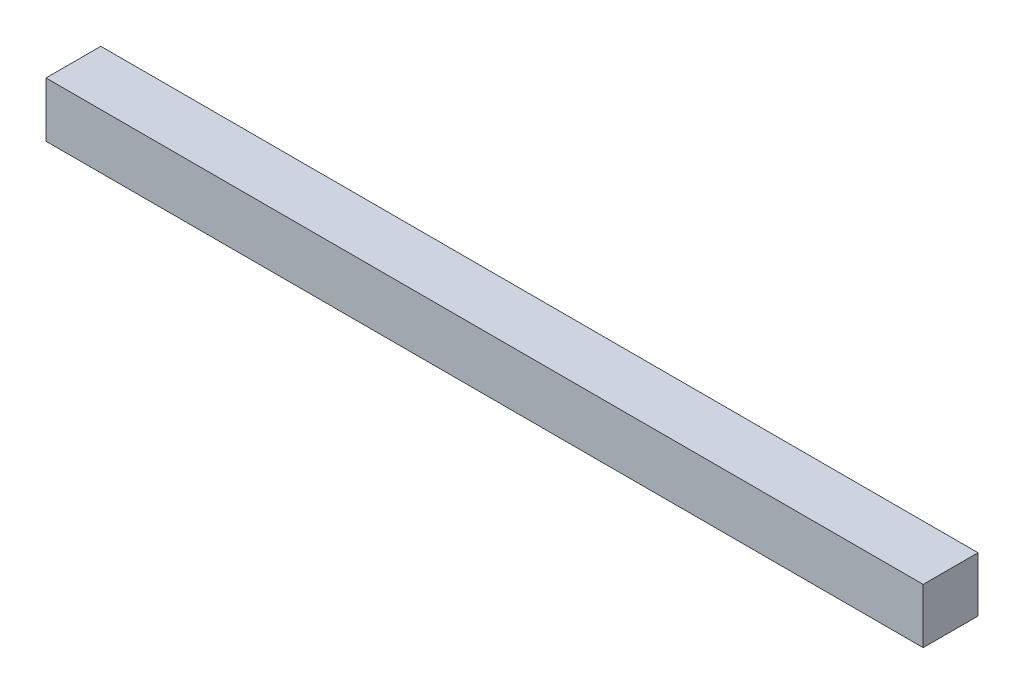
ISO-10303-21;
HEADER;
FILE_DESCRIPTION(('STEP AP214'),'2;1');
FILE_NAME('part.step','',(''),(''),'','','');
FILE_SCHEMA(('AUTOMOTIVE_DESIGN { 1 0 10303 214 1 1 1 1 }'));
ENDSEC;
DATA;
#1=APPLICATION_CONTEXT('core data for automotive mechanical design processes');
#2=APPLICATION_PROTOCOL_DEFINITION('international standard','automotive_design',2000,#1);
#3=PRODUCT_CONTEXT('',#1,'mechanical');
#4=PRODUCT('Part','Part','',(#3));
#5=PRODUCT_RELATED_PRODUCT_CATEGORY('part','',(#4));
#6=PRODUCT_DEFINITION_FORMATION('','',#4);
#7=PRODUCT_DEFINITION_CONTEXT('part definition',#1,'design');
#8=PRODUCT_DEFINITION('design','',#6,#7);
#9=PRODUCT_DEFINITION_SHAPE('','',#8);
#10=(LENGTH_UNIT() NAMED_UNIT(*) SI_UNIT(.MILLI.,.METRE.));
#11=(NAMED_UNIT(*) PLANE_ANGLE_UNIT() SI_UNIT($,.RADIAN.));
#12=(NAMED_UNIT(*) SI_UNIT($,.STERADIAN.) SOLID_ANGLE_UNIT());
#13=UNCERTAINTY_MEASURE_WITH_UNIT(LENGTH_MEASURE(1.E-05),#10,'distance_accuracy_value','');
#14=(GEOMETRIC_REPRESENTATION_CONTEXT(3) GLOBAL_UNCERTAINTY_ASSIGNED_CONTEXT((#13)) GLOBAL_UNIT_ASSIGNED_CONTEXT((#10,
#11,#12)) REPRESENTATION_CONTEXT('',''));
#15=CARTESIAN_POINT('',(0.,0.,0.));
#16=DIRECTION('',(0.,0.,1.));
#17=DIRECTION('',(1.,0.,0.));
#18=AXIS2_PLACEMENT_3D('',#15,#16,#17);
#19=CARTESIAN_POINT('',(50.8,-3.175,3.175));
#20=DIRECTION('',(0.,0.,-1.));
#21=DIRECTION('',(-1.,0.,0.));
#22=AXIS2_PLACEMENT_3D('',#19,#20,#21);
#23=PLANE('',#22);
#24=DIRECTION('',(0.,-1.,0.));
#25=VECTOR('',#24,1.);
#26=CARTESIAN_POINT('',(-50.8,-3.175,3.175));
#27=LINE('',#26,#25);
#28=CARTESIAN_POINT('',(-50.8,3.175,3.175));
#29=VERTEX_POINT('',#28);
#30=CARTESIAN_POINT('',(-50.8,-3.175,3.175));
#31=VERTEX_POINT('',#30);
#32=EDGE_CURVE('E96',#29,#31,#27,.T.);
#33=ORIENTED_EDGE('',*,*,#32,.T.);
#34=DIRECTION('',(-1.,0.,0.));
#35=VECTOR('',#34,1.);
#36=CARTESIAN_POINT('',(50.8,-3.175,3.175));
#37=LINE('',#36,#35);
#38=CARTESIAN_POINT('',(50.8,-3.175,3.175));
#39=VERTEX_POINT('',#38);
#40=EDGE_CURVE('E11',#39,#31,#37,.T.);
#41=ORIENTED_EDGE('',*,*,#40,.F.);
#42=DIRECTION('',(0.,-1.,0.));
#43=VECTOR('',#42,1.);
#44=CARTESIAN_POINT('',(50.8,-3.175,3.175));
#45=LINE('',#44,#43);
#46=CARTESIAN_POINT('',(50.8,3.175,3.175));
#47=VERTEX_POINT('',#46);
#48=EDGE_CURVE('E84',#47,#39,#45,.T.);
#49=ORIENTED_EDGE('',*,*,#48,.F.);
#50=DIRECTION('',(-1.,0.,0.));
#51=VECTOR('',#50,1.);
#52=CARTESIAN_POINT('',(50.8,3.175,3.175));
#53=LINE('',#52,#51);
#54=EDGE_CURVE('E92',#47,#29,#53,.T.);
#55=ORIENTED_EDGE('',*,*,#54,.T.);
#56=EDGE_LOOP('',(#33,#41,#49,#55));
#57=FACE_BOUND('',#56,.T.);
#58=ADVANCED_FACE('F33',(#57),#23,.F.);
#59=CARTESIAN_POINT('',(50.8,-3.175,-3.175));
#60=DIRECTION('',(0.,1.,0.));
#61=DIRECTION('',(0.,0.,1.));
#62=AXIS2_PLACEMENT_3D('',#59,#60,#61);
#63=PLANE('',#62);
#64=DIRECTION('',(0.,0.,-1.));
#65=VECTOR('',#64,1.);
#66=CARTESIAN_POINT('',(-50.8,-3.175,-3.175));
#67=LINE('',#66,#65);
#68=CARTESIAN_POINT('',(-50.8,-3.175,-3.175));
#69=VERTEX_POINT('',#68);
#70=EDGE_CURVE('E88',#31,#69,#67,.T.);
#71=ORIENTED_EDGE('',*,*,#70,.T.);
#72=DIRECTION('',(-1.,0.,0.));
#73=VECTOR('',#72,1.);
#74=CARTESIAN_POINT('',(50.8,-3.175,-3.175));
#75=LINE('',#74,#73);
#76=CARTESIAN_POINT('',(50.8,-3.175,-3.175));
#77=VERTEX_POINT('',#76);
#78=EDGE_CURVE('E41',#77,#69,#75,.T.);
#79=ORIENTED_EDGE('',*,*,#78,.F.);
#80=DIRECTION('',(0.,0.,-1.));
#81=VECTOR('',#80,1.);
#82=CARTESIAN_POINT('',(50.8,-3.175,-3.175));
#83=LINE('',#82,#81);
#84=EDGE_CURVE('E79',#39,#77,#83,.T.);
#85=ORIENTED_EDGE('',*,*,#84,.F.);
#86=ORIENTED_EDGE('',*,*,#40,.T.);
#87=EDGE_LOOP('',(#71,#79,#85,#86));
#88=FACE_BOUND('',#87,.T.);
#89=ADVANCED_FACE('F87',(#88),#63,.F.);
#90=CARTESIAN_POINT('',(50.8,-3.175,-3.175));
#91=DIRECTION('',(0.,0.,1.));
#92=DIRECTION('',(1.,0.,0.));
#93=AXIS2_PLACEMENT_3D('',#90,#91,#92);
#94=PLANE('',#93);
#95=DIRECTION('',(0.,1.,0.));
#96=VECTOR('',#95,1.);
#97=CARTESIAN_POINT('',(-50.8,-3.175,-3.175));
#98=LINE('',#97,#96);
#99=CARTESIAN_POINT('',(-50.8,3.175,-3.175));
#100=VERTEX_POINT('',#99);
#101=EDGE_CURVE('E66',#69,#100,#98,.T.);
#102=ORIENTED_EDGE('',*,*,#101,.T.);
#103=DIRECTION('',(-1.,0.,0.));
#104=VECTOR('',#103,1.);
#105=CARTESIAN_POINT('',(50.8,3.175,-3.175));
#106=LINE('',#105,#104);
#107=CARTESIAN_POINT('',(50.8,3.175,-3.175));
#108=VERTEX_POINT('',#107);
#109=EDGE_CURVE('E89',#108,#100,#106,.T.);
#110=ORIENTED_EDGE('',*,*,#109,.F.);
#111=DIRECTION('',(0.,1.,0.));
#112=VECTOR('',#111,1.);
#113=CARTESIAN_POINT('',(50.8,-3.175,-3.175));
#114=LINE('',#113,#112);
#115=EDGE_CURVE('E82',#77,#108,#114,.T.);
#116=ORIENTED_EDGE('',*,*,#115,.F.);
#117=ORIENTED_EDGE('',*,*,#78,.T.);
#118=EDGE_LOOP('',(#102,#110,#116,#117));
#119=FACE_BOUND('',#118,.T.);
#120=ADVANCED_FACE('F90',(#119),#94,.F.);
#121=CARTESIAN_POINT('',(50.8,3.175,-3.175));
#122=DIRECTION('',(0.,-1.,0.));
#123=DIRECTION('',(0.,0.,-1.));
#124=AXIS2_PLACEMENT_3D('',#121,#122,#123);
#125=PLANE('',#124);
#126=DIRECTION('',(0.,0.,1.));
#127=VECTOR('',#126,1.);
#128=CARTESIAN_POINT('',(-50.8,3.175,-3.175));
#129=LINE('',#128,#127);
#130=EDGE_CURVE('E72',#100,#29,#129,.T.);
#131=ORIENTED_EDGE('',*,*,#130,.T.);
#132=ORIENTED_EDGE('',*,*,#54,.F.);
#133=DIRECTION('',(0.,0.,1.));
#134=VECTOR('',#133,1.);
#135=CARTESIAN_POINT('',(50.8,3.175,-3.175));
#136=LINE('',#135,#134);
#137=EDGE_CURVE('E49',#108,#47,#136,.T.);
#138=ORIENTED_EDGE('',*,*,#137,.F.);
#139=ORIENTED_EDGE('',*,*,#109,.T.);
#140=EDGE_LOOP('',(#131,#132,#138,#139));
#141=FACE_BOUND('',#140,.T.);
#142=ADVANCED_FACE('F103',(#141),#125,.F.);
#143=CARTESIAN_POINT('',(50.8,0.,0.));
#144=DIRECTION('',(1.,0.,0.));
#145=DIRECTION('',(0.,0.,-1.));
#146=AXIS2_PLACEMENT_3D('',#143,#144,#145);
#147=PLANE('',#146);
#148=ORIENTED_EDGE('',*,*,#48,.T.);
#149=ORIENTED_EDGE('',*,*,#84,.T.);
#150=ORIENTED_EDGE('',*,*,#115,.T.);
#151=ORIENTED_EDGE('',*,*,#137,.T.);
#152=EDGE_LOOP('',(#148,#149,#150,#151));
#153=FACE_BOUND('',#152,.T.);
#154=ADVANCED_FACE('F80',(#153),#147,.T.);
#155=CARTESIAN_POINT('',(-50.8,0.,0.));
#156=DIRECTION('',(1.,0.,0.));
#157=DIRECTION('',(0.,0.,-1.));
#158=AXIS2_PLACEMENT_3D('',#155,#156,#157);
#159=PLANE('',#158);
#160=ORIENTED_EDGE('',*,*,#32,.F.);
#161=ORIENTED_EDGE('',*,*,#130,.F.);
#162=ORIENTED_EDGE('',*,*,#101,.F.);
#163=ORIENTED_EDGE('',*,*,#70,.F.);
#164=EDGE_LOOP('',(#160,#161,#162,#163));
#165=FACE_BOUND('',#164,.T.);
#166=ADVANCED_FACE('F106',(#165),#159,.F.);
#167=CLOSED_SHELL('',(#58,#89,#120,#142,#154,#166));
#168=MANIFOLD_SOLID_BREP('B2',#167);
#169=ADVANCED_BREP_SHAPE_REPRESENTATION('',(#18,#168),#14);
#170=SHAPE_DEFINITION_REPRESENTATION(#9,#169);
ENDSEC;
END-ISO-10303-21;
